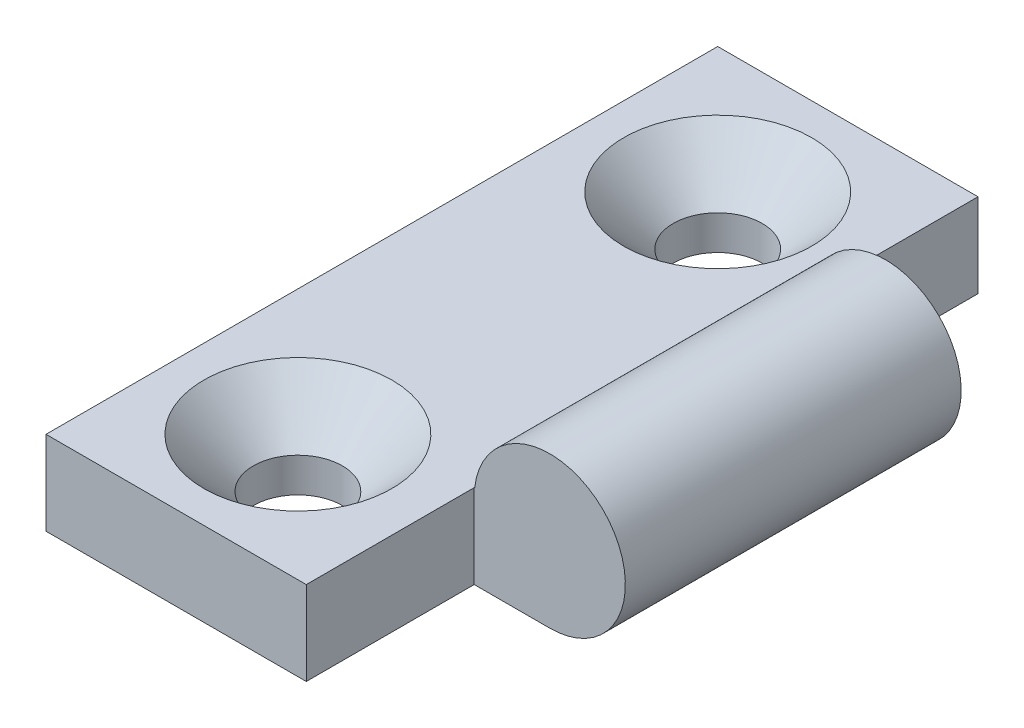
ISO-10303-21;
HEADER;
FILE_DESCRIPTION(('STEP AP214'),'2;1');
FILE_NAME('part.step','',(''),(''),'','','');
FILE_SCHEMA(('AUTOMOTIVE_DESIGN { 1 0 10303 214 1 1 1 1 }'));
ENDSEC;
DATA;
#1=APPLICATION_CONTEXT('core data for automotive mechanical design processes');
#2=APPLICATION_PROTOCOL_DEFINITION('international standard','automotive_design',2000,#1);
#3=PRODUCT_CONTEXT('',#1,'mechanical');
#4=PRODUCT('Part','Part','',(#3));
#5=PRODUCT_RELATED_PRODUCT_CATEGORY('part','',(#4));
#6=PRODUCT_DEFINITION_FORMATION('','',#4);
#7=PRODUCT_DEFINITION_CONTEXT('part definition',#1,'design');
#8=PRODUCT_DEFINITION('design','',#6,#7);
#9=PRODUCT_DEFINITION_SHAPE('','',#8);
#10=(LENGTH_UNIT() NAMED_UNIT(*) SI_UNIT(.MILLI.,.METRE.));
#11=(NAMED_UNIT(*) PLANE_ANGLE_UNIT() SI_UNIT($,.RADIAN.));
#12=(NAMED_UNIT(*) SI_UNIT($,.STERADIAN.) SOLID_ANGLE_UNIT());
#13=UNCERTAINTY_MEASURE_WITH_UNIT(LENGTH_MEASURE(1.E-05),#10,'distance_accuracy_value','');
#14=(GEOMETRIC_REPRESENTATION_CONTEXT(3) GLOBAL_UNCERTAINTY_ASSIGNED_CONTEXT((#13)) GLOBAL_UNIT_ASSIGNED_CONTEXT((#10,
#11,#12)) REPRESENTATION_CONTEXT('',''));
#15=CARTESIAN_POINT('',(0.,0.,0.));
#16=DIRECTION('',(0.,0.,1.));
#17=DIRECTION('',(1.,0.,0.));
#18=AXIS2_PLACEMENT_3D('',#15,#16,#17);
#19=CARTESIAN_POINT('',(-2.50000000000001,4.99999999999545,12.5));
#20=DIRECTION('',(0.,1.,0.));
#21=DIRECTION('',(0.,0.,1.));
#22=AXIS2_PLACEMENT_3D('',#19,#20,#21);
#23=CONICAL_SURFACE('',#22,5.600000000004,0.785398163397448);
#24=CARTESIAN_POINT('',(-2.50000000000001,2.05,12.5));
#25=DIRECTION('',(0.,1.,0.));
#26=DIRECTION('',(0.,0.,1.));
#27=AXIS2_PLACEMENT_3D('',#24,#25,#26);
#28=CIRCLE('',#27,2.65);
#29=CARTESIAN_POINT('',(-2.50000000000001,2.05,15.15));
#30=VERTEX_POINT('',#29);
#31=EDGE_CURVE('E172',#30,#30,#28,.F.);
#32=ORIENTED_EDGE('',*,*,#31,.T.);
#33=EDGE_LOOP('',(#32));
#34=FACE_BOUND('',#33,.T.);
#35=CARTESIAN_POINT('',(-2.50000000000001,4.99999999999545,12.5));
#36=DIRECTION('',(0.,1.,0.));
#37=DIRECTION('',(0.,0.,1.));
#38=AXIS2_PLACEMENT_3D('',#35,#36,#37);
#39=CIRCLE('',#38,5.600000000004);
#40=CARTESIAN_POINT('',(-2.50000000000001,4.99999999999545,18.100000000004));
#41=VERTEX_POINT('',#40);
#42=EDGE_CURVE('E20',#41,#41,#39,.F.);
#43=ORIENTED_EDGE('',*,*,#42,.F.);
#44=EDGE_LOOP('',(#43));
#45=FACE_BOUND('',#44,.T.);
#46=ADVANCED_FACE('F17',(#34,#45),#23,.F.);
#47=CARTESIAN_POINT('',(-2.50000000000001,4.99999999999545,-12.5));
#48=DIRECTION('',(0.,1.,0.));
#49=DIRECTION('',(0.,0.,1.));
#50=AXIS2_PLACEMENT_3D('',#47,#48,#49);
#51=CONICAL_SURFACE('',#50,5.60000000002674,0.785398163397448);
#52=CARTESIAN_POINT('',(-2.50000000000001,2.05,-12.5));
#53=DIRECTION('',(0.,1.,0.));
#54=DIRECTION('',(0.,0.,1.));
#55=AXIS2_PLACEMENT_3D('',#52,#53,#54);
#56=CIRCLE('',#55,2.65);
#57=CARTESIAN_POINT('',(-2.50000000000001,2.05,-9.85));
#58=VERTEX_POINT('',#57);
#59=EDGE_CURVE('E158',#58,#58,#56,.F.);
#60=ORIENTED_EDGE('',*,*,#59,.T.);
#61=EDGE_LOOP('',(#60));
#62=FACE_BOUND('',#61,.T.);
#63=CARTESIAN_POINT('',(-2.50000000000001,4.99999999999545,-12.5));
#64=DIRECTION('',(0.,1.,0.));
#65=DIRECTION('',(0.,0.,1.));
#66=AXIS2_PLACEMENT_3D('',#63,#64,#65);
#67=CIRCLE('',#66,5.60000000002674);
#68=CARTESIAN_POINT('',(-2.50000000000001,4.99999999999545,-6.89999999997326));
#69=VERTEX_POINT('',#68);
#70=EDGE_CURVE('E173',#69,#69,#67,.F.);
#71=ORIENTED_EDGE('',*,*,#70,.F.);
#72=EDGE_LOOP('',(#71));
#73=FACE_BOUND('',#72,.T.);
#74=ADVANCED_FACE('F198',(#62,#73),#51,.F.);
#75=CARTESIAN_POINT('',(0.,5.,0.));
#76=DIRECTION('',(0.,1.,0.));
#77=DIRECTION('',(0.,0.,1.));
#78=AXIS2_PLACEMENT_3D('',#75,#76,#77);
#79=PLANE('',#78);
#80=DIRECTION('',(0.,0.,1.));
#81=VECTOR('',#80,1.);
#82=CARTESIAN_POINT('',(5.52786404500042,5.,0.));
#83=LINE('',#82,#81);
#84=CARTESIAN_POINT('',(5.52786404500042,5.,9.99999999999999));
#85=VERTEX_POINT('',#84);
#86=CARTESIAN_POINT('',(5.52786404500042,5.,-10.));
#87=VERTEX_POINT('',#86);
#88=EDGE_CURVE('E85',#85,#87,#83,.F.);
#89=ORIENTED_EDGE('',*,*,#88,.T.);
#90=DIRECTION('',(1.,0.,0.));
#91=VECTOR('',#90,1.);
#92=CARTESIAN_POINT('',(5.5,5.,-10.));
#93=LINE('',#92,#91);
#94=CARTESIAN_POINT('',(5.5,5.,-10.));
#95=VERTEX_POINT('',#94);
#96=EDGE_CURVE('E188',#87,#95,#93,.F.);
#97=ORIENTED_EDGE('',*,*,#96,.T.);
#98=DIRECTION('',(0.,0.,1.));
#99=VECTOR('',#98,1.);
#100=CARTESIAN_POINT('',(5.5,5.,-20.));
#101=LINE('',#100,#99);
#102=CARTESIAN_POINT('',(5.5,5.,-20.));
#103=VERTEX_POINT('',#102);
#104=EDGE_CURVE('E152',#95,#103,#101,.F.);
#105=ORIENTED_EDGE('',*,*,#104,.T.);
#106=DIRECTION('',(1.,0.,0.));
#107=VECTOR('',#106,1.);
#108=CARTESIAN_POINT('',(-10.,5.,-20.));
#109=LINE('',#108,#107);
#110=CARTESIAN_POINT('',(-10.,5.,-20.));
#111=VERTEX_POINT('',#110);
#112=EDGE_CURVE('E161',#103,#111,#109,.F.);
#113=ORIENTED_EDGE('',*,*,#112,.T.);
#114=DIRECTION('',(0.,0.,-1.));
#115=VECTOR('',#114,1.);
#116=CARTESIAN_POINT('',(-10.,5.,-20.));
#117=LINE('',#116,#115);
#118=CARTESIAN_POINT('',(-10.,5.,20.));
#119=VERTEX_POINT('',#118);
#120=EDGE_CURVE('E141',#111,#119,#117,.F.);
#121=ORIENTED_EDGE('',*,*,#120,.T.);
#122=DIRECTION('',(-1.,0.,0.));
#123=VECTOR('',#122,1.);
#124=CARTESIAN_POINT('',(-10.,5.,20.));
#125=LINE('',#124,#123);
#126=CARTESIAN_POINT('',(5.5,5.,20.));
#127=VERTEX_POINT('',#126);
#128=EDGE_CURVE('E130',#119,#127,#125,.F.);
#129=ORIENTED_EDGE('',*,*,#128,.T.);
#130=DIRECTION('',(0.,0.,1.));
#131=VECTOR('',#130,1.);
#132=CARTESIAN_POINT('',(5.5,5.,20.));
#133=LINE('',#132,#131);
#134=CARTESIAN_POINT('',(5.5,5.,10.));
#135=VERTEX_POINT('',#134);
#136=EDGE_CURVE('E122',#127,#135,#133,.F.);
#137=ORIENTED_EDGE('',*,*,#136,.T.);
#138=DIRECTION('',(-1.,0.,0.));
#139=VECTOR('',#138,1.);
#140=CARTESIAN_POINT('',(5.5,5.,10.));
#141=LINE('',#140,#139);
#142=EDGE_CURVE('E91',#135,#85,#141,.F.);
#143=ORIENTED_EDGE('',*,*,#142,.T.);
#144=EDGE_LOOP('',(#89,#97,#105,#113,#121,#129,#137,#143));
#145=FACE_BOUND('',#144,.T.);
#146=ORIENTED_EDGE('',*,*,#70,.T.);
#147=EDGE_LOOP('',(#146));
#148=FACE_BOUND('',#147,.T.);
#149=ORIENTED_EDGE('',*,*,#42,.T.);
#150=EDGE_LOOP('',(#149));
#151=FACE_BOUND('',#150,.T.);
#152=ADVANCED_FACE('F195',(#145,#148,#151),#79,.T.);
#153=CARTESIAN_POINT('',(-2.50000000000001,5.,12.5));
#154=DIRECTION('',(0.,1.,0.));
#155=DIRECTION('',(0.,0.,1.));
#156=AXIS2_PLACEMENT_3D('',#153,#154,#155);
#157=CYLINDRICAL_SURFACE('',#156,2.65);
#158=CARTESIAN_POINT('',(-2.50000000000001,0.,12.5));
#159=DIRECTION('',(0.,1.,0.));
#160=DIRECTION('',(0.,0.,1.));
#161=AXIS2_PLACEMENT_3D('',#158,#159,#160);
#162=CIRCLE('',#161,2.65);
#163=CARTESIAN_POINT('',(-2.50000000000001,0.,15.15));
#164=VERTEX_POINT('',#163);
#165=EDGE_CURVE('E164',#164,#164,#162,.F.);
#166=ORIENTED_EDGE('',*,*,#165,.T.);
#167=EDGE_LOOP('',(#166));
#168=FACE_BOUND('',#167,.T.);
#169=ORIENTED_EDGE('',*,*,#31,.F.);
#170=EDGE_LOOP('',(#169));
#171=FACE_BOUND('',#170,.T.);
#172=ADVANCED_FACE('F240',(#168,#171),#157,.F.);
#173=CARTESIAN_POINT('',(-2.50000000000001,5.,-12.5));
#174=DIRECTION('',(0.,1.,0.));
#175=DIRECTION('',(0.,0.,1.));
#176=AXIS2_PLACEMENT_3D('',#173,#174,#175);
#177=CYLINDRICAL_SURFACE('',#176,2.65);
#178=CARTESIAN_POINT('',(-2.50000000000001,0.,-12.5));
#179=DIRECTION('',(0.,1.,0.));
#180=DIRECTION('',(0.,0.,1.));
#181=AXIS2_PLACEMENT_3D('',#178,#179,#180);
#182=CIRCLE('',#181,2.65);
#183=CARTESIAN_POINT('',(-2.50000000000001,0.,-9.85));
#184=VERTEX_POINT('',#183);
#185=EDGE_CURVE('E146',#184,#184,#182,.F.);
#186=ORIENTED_EDGE('',*,*,#185,.T.);
#187=EDGE_LOOP('',(#186));
#188=FACE_BOUND('',#187,.T.);
#189=ORIENTED_EDGE('',*,*,#59,.F.);
#190=EDGE_LOOP('',(#189));
#191=FACE_BOUND('',#190,.T.);
#192=ADVANCED_FACE('F236',(#188,#191),#177,.F.);
#193=CARTESIAN_POINT('',(-10.,5.,-20.));
#194=DIRECTION('',(1.,0.,0.));
#195=DIRECTION('',(0.,0.,-1.));
#196=AXIS2_PLACEMENT_3D('',#193,#194,#195);
#197=PLANE('',#196);
#198=DIRECTION('',(0.,1.,0.));
#199=VECTOR('',#198,1.);
#200=CARTESIAN_POINT('',(-10.,5.,20.));
#201=LINE('',#200,#199);
#202=CARTESIAN_POINT('',(-10.,0.,20.));
#203=VERTEX_POINT('',#202);
#204=EDGE_CURVE('E138',#203,#119,#201,.T.);
#205=ORIENTED_EDGE('',*,*,#204,.T.);
#206=ORIENTED_EDGE('',*,*,#120,.F.);
#207=DIRECTION('',(0.,1.,0.));
#208=VECTOR('',#207,1.);
#209=CARTESIAN_POINT('',(-10.,5.,-20.));
#210=LINE('',#209,#208);
#211=CARTESIAN_POINT('',(-10.,0.,-20.));
#212=VERTEX_POINT('',#211);
#213=EDGE_CURVE('E149',#111,#212,#210,.F.);
#214=ORIENTED_EDGE('',*,*,#213,.T.);
#215=DIRECTION('',(0.,0.,1.));
#216=VECTOR('',#215,1.);
#217=CARTESIAN_POINT('',(-10.,0.,0.));
#218=LINE('',#217,#216);
#219=EDGE_CURVE('E135',#212,#203,#218,.T.);
#220=ORIENTED_EDGE('',*,*,#219,.T.);
#221=EDGE_LOOP('',(#205,#206,#214,#220));
#222=FACE_BOUND('',#221,.T.);
#223=ADVANCED_FACE('F232',(#222),#197,.F.);
#224=CARTESIAN_POINT('',(-10.,5.,20.));
#225=DIRECTION('',(0.,0.,-1.));
#226=DIRECTION('',(-1.,0.,0.));
#227=AXIS2_PLACEMENT_3D('',#224,#225,#226);
#228=PLANE('',#227);
#229=DIRECTION('',(0.,1.,0.));
#230=VECTOR('',#229,1.);
#231=CARTESIAN_POINT('',(5.5,9.,20.));
#232=LINE('',#231,#230);
#233=CARTESIAN_POINT('',(5.5,0.,20.));
#234=VERTEX_POINT('',#233);
#235=EDGE_CURVE('E127',#234,#127,#232,.T.);
#236=ORIENTED_EDGE('',*,*,#235,.T.);
#237=ORIENTED_EDGE('',*,*,#128,.F.);
#238=ORIENTED_EDGE('',*,*,#204,.F.);
#239=DIRECTION('',(1.,0.,0.));
#240=VECTOR('',#239,1.);
#241=CARTESIAN_POINT('',(0.,0.,20.));
#242=LINE('',#241,#240);
#243=EDGE_CURVE('E110',#203,#234,#242,.T.);
#244=ORIENTED_EDGE('',*,*,#243,.T.);
#245=EDGE_LOOP('',(#236,#237,#238,#244));
#246=FACE_BOUND('',#245,.T.);
#247=ADVANCED_FACE('F228',(#246),#228,.F.);
#248=CARTESIAN_POINT('',(5.5,9.,20.));
#249=DIRECTION('',(-1.,0.,0.));
#250=DIRECTION('',(0.,0.,1.));
#251=AXIS2_PLACEMENT_3D('',#248,#249,#250);
#252=PLANE('',#251);
#253=ORIENTED_EDGE('',*,*,#235,.F.);
#254=DIRECTION('',(0.,0.,1.));
#255=VECTOR('',#254,1.);
#256=CARTESIAN_POINT('',(5.5,0.,0.));
#257=LINE('',#256,#255);
#258=CARTESIAN_POINT('',(5.5,0.,10.));
#259=VERTEX_POINT('',#258);
#260=EDGE_CURVE('E108',#234,#259,#257,.F.);
#261=ORIENTED_EDGE('',*,*,#260,.T.);
#262=DIRECTION('',(0.,1.,0.));
#263=VECTOR('',#262,1.);
#264=CARTESIAN_POINT('',(5.5,9.,10.));
#265=LINE('',#264,#263);
#266=EDGE_CURVE('E107',#259,#135,#265,.T.);
#267=ORIENTED_EDGE('',*,*,#266,.T.);
#268=ORIENTED_EDGE('',*,*,#136,.F.);
#269=EDGE_LOOP('',(#253,#261,#267,#268));
#270=FACE_BOUND('',#269,.T.);
#271=ADVANCED_FACE('F225',(#270),#252,.F.);
#272=CARTESIAN_POINT('',(5.5,9.,10.));
#273=DIRECTION('',(0.,0.,-1.));
#274=DIRECTION('',(-1.,0.,0.));
#275=AXIS2_PLACEMENT_3D('',#272,#273,#274);
#276=PLANE('',#275);
#277=ORIENTED_EDGE('',*,*,#266,.F.);
#278=DIRECTION('',(1.,0.,0.));
#279=VECTOR('',#278,1.);
#280=CARTESIAN_POINT('',(0.,0.,10.));
#281=LINE('',#280,#279);
#282=CARTESIAN_POINT('',(10.,0.,9.99999999999999));
#283=VERTEX_POINT('',#282);
#284=EDGE_CURVE('E100',#259,#283,#281,.T.);
#285=ORIENTED_EDGE('',*,*,#284,.T.);
#286=CARTESIAN_POINT('',(10.,4.5,9.99999999999999));
#287=DIRECTION('',(0.,0.,1.));
#288=DIRECTION('',(1.,0.,0.));
#289=AXIS2_PLACEMENT_3D('',#286,#287,#288);
#290=CIRCLE('',#289,4.5);
#291=EDGE_CURVE('E80',#85,#283,#290,.F.);
#292=ORIENTED_EDGE('',*,*,#291,.F.);
#293=ORIENTED_EDGE('',*,*,#142,.F.);
#294=EDGE_LOOP('',(#277,#285,#292,#293));
#295=FACE_BOUND('',#294,.T.);
#296=ADVANCED_FACE('F105',(#295),#276,.F.);
#297=CARTESIAN_POINT('',(10.,4.5,-20.));
#298=DIRECTION('',(0.,0.,1.));
#299=DIRECTION('',(1.,0.,0.));
#300=AXIS2_PLACEMENT_3D('',#297,#298,#299);
#301=CYLINDRICAL_SURFACE('',#300,4.5);
#302=ORIENTED_EDGE('',*,*,#291,.T.);
#303=DIRECTION('',(0.,0.,1.));
#304=VECTOR('',#303,1.);
#305=CARTESIAN_POINT('',(10.,0.,0.));
#306=LINE('',#305,#304);
#307=CARTESIAN_POINT('',(10.,0.,-10.));
#308=VERTEX_POINT('',#307);
#309=EDGE_CURVE('E84',#283,#308,#306,.F.);
#310=ORIENTED_EDGE('',*,*,#309,.T.);
#311=CARTESIAN_POINT('',(10.,4.5,-10.));
#312=DIRECTION('',(0.,0.,1.));
#313=DIRECTION('',(1.,0.,0.));
#314=AXIS2_PLACEMENT_3D('',#311,#312,#313);
#315=CIRCLE('',#314,4.5);
#316=EDGE_CURVE('E90',#308,#87,#315,.T.);
#317=ORIENTED_EDGE('',*,*,#316,.T.);
#318=ORIENTED_EDGE('',*,*,#88,.F.);
#319=EDGE_LOOP('',(#302,#310,#317,#318));
#320=FACE_BOUND('',#319,.T.);
#321=ADVANCED_FACE('F82',(#320),#301,.T.);
#322=CARTESIAN_POINT('',(5.5,9.,-10.));
#323=DIRECTION('',(0.,0.,1.));
#324=DIRECTION('',(1.,0.,0.));
#325=AXIS2_PLACEMENT_3D('',#322,#323,#324);
#326=PLANE('',#325);
#327=ORIENTED_EDGE('',*,*,#316,.F.);
#328=DIRECTION('',(1.,0.,0.));
#329=VECTOR('',#328,1.);
#330=CARTESIAN_POINT('',(0.,0.,-10.));
#331=LINE('',#330,#329);
#332=CARTESIAN_POINT('',(5.5,0.,-10.));
#333=VERTEX_POINT('',#332);
#334=EDGE_CURVE('E103',#308,#333,#331,.F.);
#335=ORIENTED_EDGE('',*,*,#334,.T.);
#336=DIRECTION('',(0.,1.,0.));
#337=VECTOR('',#336,1.);
#338=CARTESIAN_POINT('',(5.5,9.,-10.));
#339=LINE('',#338,#337);
#340=EDGE_CURVE('E168',#333,#95,#339,.T.);
#341=ORIENTED_EDGE('',*,*,#340,.T.);
#342=ORIENTED_EDGE('',*,*,#96,.F.);
#343=EDGE_LOOP('',(#327,#335,#341,#342));
#344=FACE_BOUND('',#343,.T.);
#345=ADVANCED_FACE('F216',(#344),#326,.F.);
#346=CARTESIAN_POINT('',(5.5,9.,-20.));
#347=DIRECTION('',(-1.,0.,0.));
#348=DIRECTION('',(0.,0.,1.));
#349=AXIS2_PLACEMENT_3D('',#346,#347,#348);
#350=PLANE('',#349);
#351=ORIENTED_EDGE('',*,*,#340,.F.);
#352=DIRECTION('',(0.,0.,1.));
#353=VECTOR('',#352,1.);
#354=CARTESIAN_POINT('',(5.5,0.,0.));
#355=LINE('',#354,#353);
#356=CARTESIAN_POINT('',(5.5,0.,-20.));
#357=VERTEX_POINT('',#356);
#358=EDGE_CURVE('E26',#333,#357,#355,.F.);
#359=ORIENTED_EDGE('',*,*,#358,.T.);
#360=DIRECTION('',(0.,1.,0.));
#361=VECTOR('',#360,1.);
#362=CARTESIAN_POINT('',(5.5,5.,-20.));
#363=LINE('',#362,#361);
#364=EDGE_CURVE('E34',#357,#103,#363,.T.);
#365=ORIENTED_EDGE('',*,*,#364,.T.);
#366=ORIENTED_EDGE('',*,*,#104,.F.);
#367=EDGE_LOOP('',(#351,#359,#365,#366));
#368=FACE_BOUND('',#367,.T.);
#369=ADVANCED_FACE('F211',(#368),#350,.F.);
#370=CARTESIAN_POINT('',(-10.,5.,-20.));
#371=DIRECTION('',(0.,0.,1.));
#372=DIRECTION('',(1.,0.,0.));
#373=AXIS2_PLACEMENT_3D('',#370,#371,#372);
#374=PLANE('',#373);
#375=ORIENTED_EDGE('',*,*,#364,.F.);
#376=DIRECTION('',(1.,0.,0.));
#377=VECTOR('',#376,1.);
#378=CARTESIAN_POINT('',(0.,0.,-20.));
#379=LINE('',#378,#377);
#380=EDGE_CURVE('E11',#357,#212,#379,.F.);
#381=ORIENTED_EDGE('',*,*,#380,.T.);
#382=ORIENTED_EDGE('',*,*,#213,.F.);
#383=ORIENTED_EDGE('',*,*,#112,.F.);
#384=EDGE_LOOP('',(#375,#381,#382,#383));
#385=FACE_BOUND('',#384,.T.);
#386=ADVANCED_FACE('F206',(#385),#374,.F.);
#387=CARTESIAN_POINT('',(0.,0.,0.));
#388=DIRECTION('',(0.,1.,0.));
#389=DIRECTION('',(0.,0.,1.));
#390=AXIS2_PLACEMENT_3D('',#387,#388,#389);
#391=PLANE('',#390);
#392=ORIENTED_EDGE('',*,*,#358,.F.);
#393=ORIENTED_EDGE('',*,*,#334,.F.);
#394=ORIENTED_EDGE('',*,*,#309,.F.);
#395=ORIENTED_EDGE('',*,*,#284,.F.);
#396=ORIENTED_EDGE('',*,*,#260,.F.);
#397=ORIENTED_EDGE('',*,*,#243,.F.);
#398=ORIENTED_EDGE('',*,*,#219,.F.);
#399=ORIENTED_EDGE('',*,*,#380,.F.);
#400=EDGE_LOOP('',(#392,#393,#394,#395,#396,#397,#398,#399));
#401=FACE_BOUND('',#400,.T.);
#402=ORIENTED_EDGE('',*,*,#185,.F.);
#403=EDGE_LOOP('',(#402));
#404=FACE_BOUND('',#403,.T.);
#405=ORIENTED_EDGE('',*,*,#165,.F.);
#406=EDGE_LOOP('',(#405));
#407=FACE_BOUND('',#406,.T.);
#408=ADVANCED_FACE('F97',(#401,#404,#407),#391,.F.);
#409=CLOSED_SHELL('',(#46,#74,#152,#172,#192,#223,#247,#271,#296,#321,#345,#369,#386,#408));
#410=MANIFOLD_SOLID_BREP('B1',#409);
#411=ADVANCED_BREP_SHAPE_REPRESENTATION('',(#18,#410),#14);
#412=SHAPE_DEFINITION_REPRESENTATION(#9,#411);
ENDSEC;
END-ISO-10303-21;
